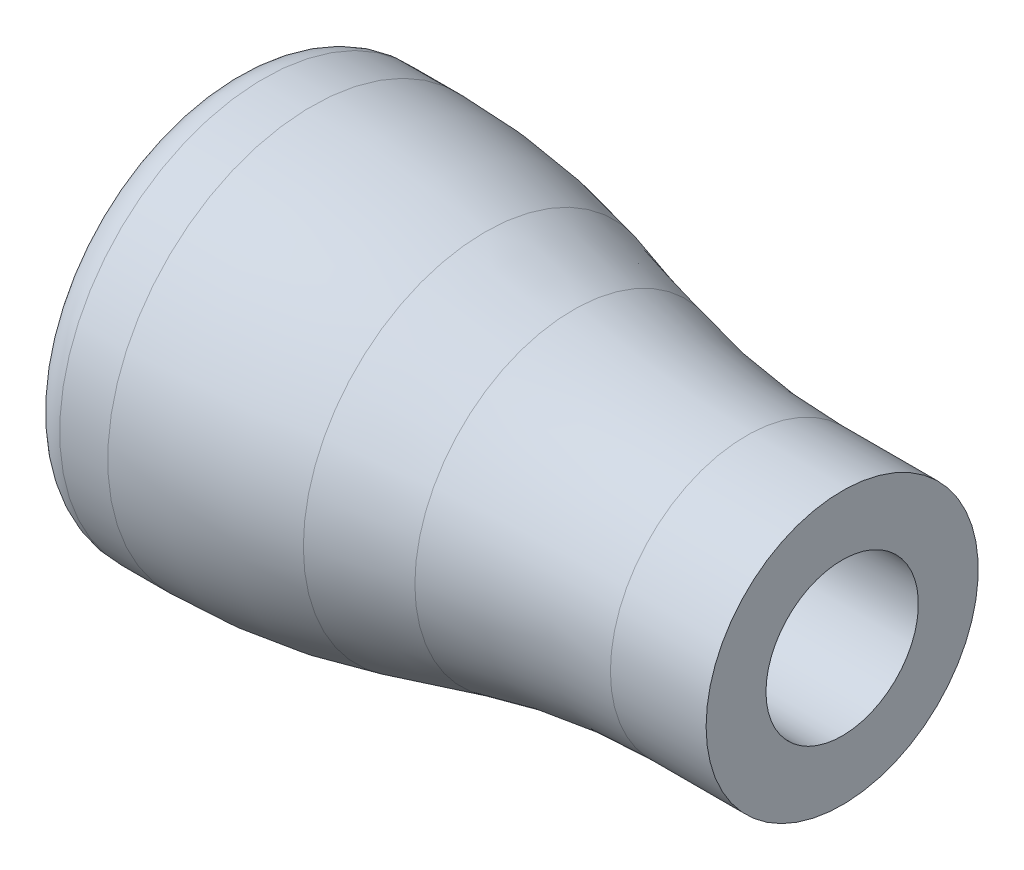
ISO-10303-21;
HEADER;
FILE_DESCRIPTION(('STEP AP214'),'2;1');
FILE_NAME('part.step','',(''),(''),'','','');
FILE_SCHEMA(('AUTOMOTIVE_DESIGN { 1 0 10303 214 1 1 1 1 }'));
ENDSEC;
DATA;
#1=APPLICATION_CONTEXT('core data for automotive mechanical design processes');
#2=APPLICATION_PROTOCOL_DEFINITION('international standard','automotive_design',2000,#1);
#3=PRODUCT_CONTEXT('',#1,'mechanical');
#4=PRODUCT('Part','Part','',(#3));
#5=PRODUCT_RELATED_PRODUCT_CATEGORY('part','',(#4));
#6=PRODUCT_DEFINITION_FORMATION('','',#4);
#7=PRODUCT_DEFINITION_CONTEXT('part definition',#1,'design');
#8=PRODUCT_DEFINITION('design','',#6,#7);
#9=PRODUCT_DEFINITION_SHAPE('','',#8);
#10=(LENGTH_UNIT() NAMED_UNIT(*) SI_UNIT(.MILLI.,.METRE.));
#11=(NAMED_UNIT(*) PLANE_ANGLE_UNIT() SI_UNIT($,.RADIAN.));
#12=(NAMED_UNIT(*) SI_UNIT($,.STERADIAN.) SOLID_ANGLE_UNIT());
#13=UNCERTAINTY_MEASURE_WITH_UNIT(LENGTH_MEASURE(1.E-05),#10,'distance_accuracy_value','');
#14=(GEOMETRIC_REPRESENTATION_CONTEXT(3) GLOBAL_UNCERTAINTY_ASSIGNED_CONTEXT((#13)) GLOBAL_UNIT_ASSIGNED_CONTEXT((#10,
#11,#12)) REPRESENTATION_CONTEXT('',''));
#15=CARTESIAN_POINT('',(0.,0.,0.));
#16=DIRECTION('',(0.,0.,1.));
#17=DIRECTION('',(1.,0.,0.));
#18=AXIS2_PLACEMENT_3D('',#15,#16,#17);
#19=CARTESIAN_POINT('',(-9.,0.,0.));
#20=DIRECTION('',(1.,0.,0.));
#21=DIRECTION('',(0.,0.,-1.));
#22=AXIS2_PLACEMENT_3D('',#19,#20,#21);
#23=PLANE('',#22);
#24=CARTESIAN_POINT('',(-9.,0.,0.));
#25=DIRECTION('',(1.,0.,0.));
#26=DIRECTION('',(0.,0.,-1.));
#27=AXIS2_PLACEMENT_3D('',#24,#25,#26);
#28=CIRCLE('',#27,2.5);
#29=CARTESIAN_POINT('',(-9.,0.,-2.5));
#30=VERTEX_POINT('',#29);
#31=EDGE_CURVE('E51',#30,#30,#28,.F.);
#32=ORIENTED_EDGE('',*,*,#31,.T.);
#33=EDGE_LOOP('',(#32));
#34=FACE_BOUND('',#33,.T.);
#35=CARTESIAN_POINT('',(-9.,0.,0.));
#36=DIRECTION('',(1.,0.,0.));
#37=DIRECTION('',(0.,0.,-1.));
#38=AXIS2_PLACEMENT_3D('',#35,#36,#37);
#39=CIRCLE('',#38,2.057639320225);
#40=CARTESIAN_POINT('',(-9.,0.,-2.057639320225));
#41=VERTEX_POINT('',#40);
#42=EDGE_CURVE('E75',#41,#41,#39,.T.);
#43=ORIENTED_EDGE('',*,*,#42,.T.);
#44=EDGE_LOOP('',(#43));
#45=FACE_BOUND('',#44,.T.);
#46=ADVANCED_FACE('F43',(#34,#45),#23,.F.);
#47=CARTESIAN_POINT('',(-11.0024368323103,0.,0.));
#48=DIRECTION('',(-1.,0.,0.));
#49=DIRECTION('',(0.,0.,1.));
#50=AXIS2_PLACEMENT_3D('',#47,#48,#49);
#51=CYLINDRICAL_SURFACE('',#50,3.);
#52=CARTESIAN_POINT('',(-8.5,0.,0.));
#53=DIRECTION('',(1.,0.,0.));
#54=DIRECTION('',(0.,0.,-1.));
#55=AXIS2_PLACEMENT_3D('',#52,#53,#54);
#56=CIRCLE('',#55,3.);
#57=CARTESIAN_POINT('',(-8.5,0.,-3.));
#58=VERTEX_POINT('',#57);
#59=EDGE_CURVE('E10',#58,#58,#56,.T.);
#60=ORIENTED_EDGE('',*,*,#59,.T.);
#61=EDGE_LOOP('',(#60));
#62=FACE_BOUND('',#61,.T.);
#63=CARTESIAN_POINT('',(-7.793765408777,0.,0.));
#64=DIRECTION('',(1.,0.,0.));
#65=DIRECTION('',(0.,0.,-1.));
#66=AXIS2_PLACEMENT_3D('',#63,#64,#65);
#67=CIRCLE('',#66,3.);
#68=CARTESIAN_POINT('',(-7.793765408777,0.,-3.));
#69=VERTEX_POINT('',#68);
#70=EDGE_CURVE('E71',#69,#69,#67,.F.);
#71=ORIENTED_EDGE('',*,*,#70,.T.);
#72=EDGE_LOOP('',(#71));
#73=FACE_BOUND('',#72,.T.);
#74=ADVANCED_FACE('F132',(#62,#73),#51,.T.);
#75=CARTESIAN_POINT('',(-2.7,0.,0.));
#76=DIRECTION('',(-1.,0.,0.));
#77=DIRECTION('',(0.,0.,1.));
#78=AXIS2_PLACEMENT_3D('',#75,#76,#77);
#79=CONICAL_SURFACE('',#78,2.,0.257323714971089);
#80=CARTESIAN_POINT('',(-3.95116758401943,0.,0.));
#81=DIRECTION('',(-1.,0.,0.));
#82=DIRECTION('',(0.,0.,1.));
#83=AXIS2_PLACEMENT_3D('',#80,#81,#82);
#84=CIRCLE('',#83,2.32925462737354);
#85=CARTESIAN_POINT('',(-3.95116758401943,0.,2.32925462737354));
#86=VERTEX_POINT('',#85);
#87=EDGE_CURVE('E61',#86,#86,#84,.T.);
#88=ORIENTED_EDGE('',*,*,#87,.T.);
#89=EDGE_LOOP('',(#88));
#90=FACE_BOUND('',#89,.T.);
#91=CARTESIAN_POINT('',(-5.24883241598056,0.,0.));
#92=DIRECTION('',(1.,0.,0.));
#93=DIRECTION('',(0.,0.,-1.));
#94=AXIS2_PLACEMENT_3D('',#91,#92,#93);
#95=CIRCLE('',#94,2.67074537262646);
#96=CARTESIAN_POINT('',(-5.24883241598056,0.,-2.67074537262646));
#97=VERTEX_POINT('',#96);
#98=EDGE_CURVE('E67',#97,#97,#95,.T.);
#99=ORIENTED_EDGE('',*,*,#98,.T.);
#100=EDGE_LOOP('',(#99));
#101=FACE_BOUND('',#100,.T.);
#102=ADVANCED_FACE('F138',(#90,#101),#79,.T.);
#103=CARTESIAN_POINT('',(-11.0024368323103,0.,0.));
#104=DIRECTION('',(-1.,0.,0.));
#105=DIRECTION('',(0.,0.,1.));
#106=AXIS2_PLACEMENT_3D('',#103,#104,#105);
#107=CYLINDRICAL_SURFACE('',#106,2.);
#108=CARTESIAN_POINT('',(-1.406234591223,0.,0.));
#109=DIRECTION('',(-1.,0.,0.));
#110=DIRECTION('',(0.,0.,1.));
#111=AXIS2_PLACEMENT_3D('',#108,#109,#110);
#112=CIRCLE('',#111,2.);
#113=CARTESIAN_POINT('',(-1.406234591223,0.,2.));
#114=VERTEX_POINT('',#113);
#115=EDGE_CURVE('E56',#114,#114,#112,.F.);
#116=ORIENTED_EDGE('',*,*,#115,.T.);
#117=EDGE_LOOP('',(#116));
#118=FACE_BOUND('',#117,.T.);
#119=CARTESIAN_POINT('',(0.,0.,0.));
#120=DIRECTION('',(-1.,0.,0.));
#121=DIRECTION('',(0.,0.,1.));
#122=AXIS2_PLACEMENT_3D('',#119,#120,#121);
#123=CIRCLE('',#122,2.);
#124=CARTESIAN_POINT('',(0.,0.,2.));
#125=VERTEX_POINT('',#124);
#126=EDGE_CURVE('E83',#125,#125,#123,.T.);
#127=ORIENTED_EDGE('',*,*,#126,.T.);
#128=EDGE_LOOP('',(#127));
#129=FACE_BOUND('',#128,.T.);
#130=ADVANCED_FACE('F162',(#118,#129),#107,.T.);
#131=CARTESIAN_POINT('',(0.,2.,0.));
#132=DIRECTION('',(-1.,0.,0.));
#133=DIRECTION('',(0.,0.,1.));
#134=AXIS2_PLACEMENT_3D('',#131,#132,#133);
#135=PLANE('',#134);
#136=CARTESIAN_POINT('',(0.,0.,0.));
#137=DIRECTION('',(-1.,0.,0.));
#138=DIRECTION('',(0.,0.,1.));
#139=AXIS2_PLACEMENT_3D('',#136,#137,#138);
#140=CIRCLE('',#139,1.12);
#141=CARTESIAN_POINT('',(0.,0.,1.12));
#142=VERTEX_POINT('',#141);
#143=EDGE_CURVE('E107',#142,#142,#140,.T.);
#144=ORIENTED_EDGE('',*,*,#143,.T.);
#145=EDGE_LOOP('',(#144));
#146=FACE_BOUND('',#145,.T.);
#147=ORIENTED_EDGE('',*,*,#126,.F.);
#148=EDGE_LOOP('',(#147));
#149=FACE_BOUND('',#148,.T.);
#150=ADVANCED_FACE('F112',(#146,#149),#135,.F.);
#151=CARTESIAN_POINT('',(-11.0024368323103,0.,0.));
#152=DIRECTION('',(-1.,0.,0.));
#153=DIRECTION('',(0.,0.,1.));
#154=AXIS2_PLACEMENT_3D('',#151,#152,#153);
#155=CYLINDRICAL_SURFACE('',#154,2.08);
#156=CARTESIAN_POINT('',(-8.95,0.,0.));
#157=DIRECTION('',(-1.,0.,0.));
#158=DIRECTION('',(0.,0.,1.));
#159=AXIS2_PLACEMENT_3D('',#156,#157,#158);
#160=CIRCLE('',#159,2.08);
#161=CARTESIAN_POINT('',(-8.95,0.,2.08));
#162=VERTEX_POINT('',#161);
#163=EDGE_CURVE('E87',#162,#162,#160,.T.);
#164=ORIENTED_EDGE('',*,*,#163,.T.);
#165=EDGE_LOOP('',(#164));
#166=FACE_BOUND('',#165,.T.);
#167=CARTESIAN_POINT('',(-6.9,0.,0.));
#168=DIRECTION('',(-1.,0.,0.));
#169=DIRECTION('',(0.,0.,1.));
#170=AXIS2_PLACEMENT_3D('',#167,#168,#169);
#171=CIRCLE('',#170,2.08);
#172=CARTESIAN_POINT('',(-6.9,0.,2.08));
#173=VERTEX_POINT('',#172);
#174=EDGE_CURVE('E91',#173,#173,#171,.T.);
#175=ORIENTED_EDGE('',*,*,#174,.F.);
#176=EDGE_LOOP('',(#175));
#177=FACE_BOUND('',#176,.T.);
#178=ADVANCED_FACE('F174',(#166,#177),#155,.F.);
#179=CARTESIAN_POINT('',(-6.9,2.08,0.));
#180=DIRECTION('',(-1.,0.,0.));
#181=DIRECTION('',(0.,0.,1.));
#182=AXIS2_PLACEMENT_3D('',#179,#180,#181);
#183=PLANE('',#182);
#184=ORIENTED_EDGE('',*,*,#174,.T.);
#185=EDGE_LOOP('',(#184));
#186=FACE_BOUND('',#185,.T.);
#187=CARTESIAN_POINT('',(-6.9,0.,0.));
#188=DIRECTION('',(-1.,0.,0.));
#189=DIRECTION('',(0.,0.,1.));
#190=AXIS2_PLACEMENT_3D('',#187,#188,#189);
#191=CIRCLE('',#190,0.326243130921861);
#192=CARTESIAN_POINT('',(-6.9,0.,0.326243130921861));
#193=VERTEX_POINT('',#192);
#194=EDGE_CURVE('E95',#193,#193,#191,.T.);
#195=ORIENTED_EDGE('',*,*,#194,.F.);
#196=EDGE_LOOP('',(#195));
#197=FACE_BOUND('',#196,.T.);
#198=ADVANCED_FACE('F177',(#186,#197),#183,.T.);
#199=CARTESIAN_POINT('',(-11.0024368323103,0.,0.));
#200=DIRECTION('',(-1.,0.,0.));
#201=DIRECTION('',(0.,0.,1.));
#202=AXIS2_PLACEMENT_3D('',#199,#200,#201);
#203=CYLINDRICAL_SURFACE('',#202,0.326243130921861);
#204=ORIENTED_EDGE('',*,*,#194,.T.);
#205=EDGE_LOOP('',(#204));
#206=FACE_BOUND('',#205,.T.);
#207=CARTESIAN_POINT('',(-2.3,0.,0.));
#208=DIRECTION('',(-1.,0.,0.));
#209=DIRECTION('',(0.,0.,1.));
#210=AXIS2_PLACEMENT_3D('',#207,#208,#209);
#211=CIRCLE('',#210,0.326243130921861);
#212=CARTESIAN_POINT('',(-2.3,0.,0.326243130921861));
#213=VERTEX_POINT('',#212);
#214=EDGE_CURVE('E99',#213,#213,#211,.T.);
#215=ORIENTED_EDGE('',*,*,#214,.F.);
#216=EDGE_LOOP('',(#215));
#217=FACE_BOUND('',#216,.T.);
#218=ADVANCED_FACE('F128',(#206,#217),#203,.F.);
#219=CARTESIAN_POINT('',(-2.3,0.326243130921861,0.));
#220=DIRECTION('',(1.,0.,0.));
#221=DIRECTION('',(0.,0.,-1.));
#222=AXIS2_PLACEMENT_3D('',#219,#220,#221);
#223=PLANE('',#222);
#224=ORIENTED_EDGE('',*,*,#214,.T.);
#225=EDGE_LOOP('',(#224));
#226=FACE_BOUND('',#225,.T.);
#227=CARTESIAN_POINT('',(-2.3,0.,0.));
#228=DIRECTION('',(-1.,0.,0.));
#229=DIRECTION('',(0.,0.,1.));
#230=AXIS2_PLACEMENT_3D('',#227,#228,#229);
#231=CIRCLE('',#230,1.12);
#232=CARTESIAN_POINT('',(-2.3,0.,1.12));
#233=VERTEX_POINT('',#232);
#234=EDGE_CURVE('E103',#233,#233,#231,.T.);
#235=ORIENTED_EDGE('',*,*,#234,.F.);
#236=EDGE_LOOP('',(#235));
#237=FACE_BOUND('',#236,.T.);
#238=ADVANCED_FACE('F118',(#226,#237),#223,.T.);
#239=CARTESIAN_POINT('',(-11.0024368323103,0.,0.));
#240=DIRECTION('',(-1.,0.,0.));
#241=DIRECTION('',(0.,0.,1.));
#242=AXIS2_PLACEMENT_3D('',#239,#240,#241);
#243=CYLINDRICAL_SURFACE('',#242,1.12);
#244=ORIENTED_EDGE('',*,*,#234,.T.);
#245=EDGE_LOOP('',(#244));
#246=FACE_BOUND('',#245,.T.);
#247=ORIENTED_EDGE('',*,*,#143,.F.);
#248=EDGE_LOOP('',(#247));
#249=FACE_BOUND('',#248,.T.);
#250=ADVANCED_FACE('F115',(#246,#249),#243,.F.);
#251=CARTESIAN_POINT('',(-9.,0.,0.));
#252=DIRECTION('',(1.,0.,0.));
#253=DIRECTION('',(0.,0.,-1.));
#254=AXIS2_PLACEMENT_3D('',#251,#252,#253);
#255=TOROIDAL_SURFACE('',#254,2.08,0.05);
#256=CARTESIAN_POINT('',(-8.96666666666664,0.,0.));
#257=DIRECTION('',(-1.,0.,0.));
#258=DIRECTION('',(0.,0.,1.));
#259=AXIS2_PLACEMENT_3D('',#256,#257,#258);
#260=CIRCLE('',#259,2.04273220037497);
#261=CARTESIAN_POINT('',(-8.96666666666664,0.,2.04273220037497));
#262=VERTEX_POINT('',#261);
#263=EDGE_CURVE('E79',#262,#262,#260,.T.);
#264=ORIENTED_EDGE('',*,*,#263,.T.);
#265=EDGE_LOOP('',(#264));
#266=FACE_BOUND('',#265,.T.);
#267=ORIENTED_EDGE('',*,*,#163,.F.);
#268=EDGE_LOOP('',(#267));
#269=FACE_BOUND('',#268,.T.);
#270=ADVANCED_FACE('F117',(#266,#269),#255,.T.);
#271=CARTESIAN_POINT('',(-8.98,0.,0.));
#272=DIRECTION('',(-1.,0.,0.));
#273=DIRECTION('',(0.,0.,1.));
#274=AXIS2_PLACEMENT_3D('',#271,#272,#273);
#275=TOROIDAL_SURFACE('',#274,2.057639320225,0.02);
#276=ORIENTED_EDGE('',*,*,#42,.F.);
#277=EDGE_LOOP('',(#276));
#278=FACE_BOUND('',#277,.T.);
#279=ORIENTED_EDGE('',*,*,#263,.F.);
#280=EDGE_LOOP('',(#279));
#281=FACE_BOUND('',#280,.T.);
#282=ADVANCED_FACE('F125',(#278,#281),#275,.T.);
#283=CARTESIAN_POINT('',(-7.793765408777,0.,0.));
#284=DIRECTION('',(1.,0.,0.));
#285=DIRECTION('',(0.,0.,-1.));
#286=AXIS2_PLACEMENT_3D('',#283,#284,#285);
#287=DEGENERATE_TOROIDAL_SURFACE('',#286,7.,10.,.F.);
#288=ORIENTED_EDGE('',*,*,#98,.F.);
#289=EDGE_LOOP('',(#288));
#290=FACE_BOUND('',#289,.T.);
#291=ORIENTED_EDGE('',*,*,#70,.F.);
#292=EDGE_LOOP('',(#291));
#293=FACE_BOUND('',#292,.T.);
#294=ADVANCED_FACE('F145',(#290,#293),#287,.F.);
#295=CARTESIAN_POINT('',(-1.406234591223,0.,0.));
#296=DIRECTION('',(-1.,0.,0.));
#297=DIRECTION('',(0.,0.,1.));
#298=AXIS2_PLACEMENT_3D('',#295,#296,#297);
#299=TOROIDAL_SURFACE('',#298,12.,10.);
#300=ORIENTED_EDGE('',*,*,#115,.F.);
#301=EDGE_LOOP('',(#300));
#302=FACE_BOUND('',#301,.T.);
#303=ORIENTED_EDGE('',*,*,#87,.F.);
#304=EDGE_LOOP('',(#303));
#305=FACE_BOUND('',#304,.T.);
#306=ADVANCED_FACE('F148',(#302,#305),#299,.F.);
#307=CARTESIAN_POINT('',(-8.5,0.,0.));
#308=DIRECTION('',(1.,0.,0.));
#309=DIRECTION('',(0.,0.,-1.));
#310=AXIS2_PLACEMENT_3D('',#307,#308,#309);
#311=TOROIDAL_SURFACE('',#310,2.5,0.5);
#312=ORIENTED_EDGE('',*,*,#59,.F.);
#313=EDGE_LOOP('',(#312));
#314=FACE_BOUND('',#313,.T.);
#315=ORIENTED_EDGE('',*,*,#31,.F.);
#316=EDGE_LOOP('',(#315));
#317=FACE_BOUND('',#316,.T.);
#318=ADVANCED_FACE('F45',(#314,#317),#311,.T.);
#319=CLOSED_SHELL('',(#46,#74,#102,#130,#150,#178,#198,#218,#238,#250,#270,#282,#294,#306,#318));
#320=MANIFOLD_SOLID_BREP('B2',#319);
#321=ADVANCED_BREP_SHAPE_REPRESENTATION('',(#18,#320),#14);
#322=SHAPE_DEFINITION_REPRESENTATION(#9,#321);
ENDSEC;
END-ISO-10303-21;
